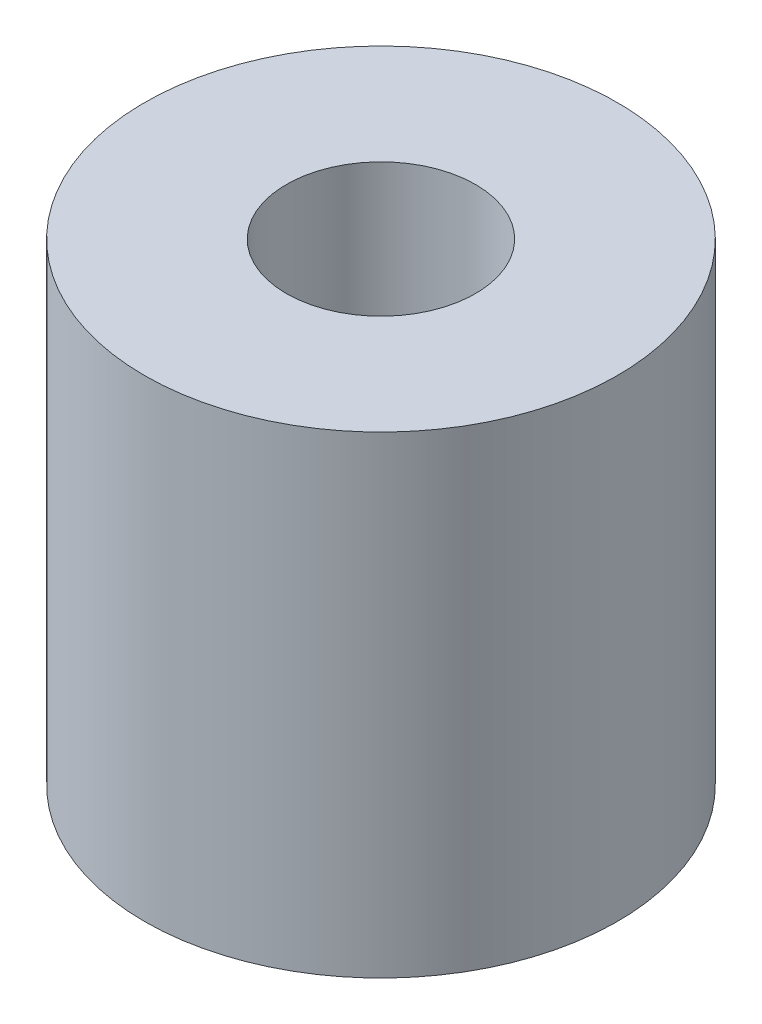
ISO-10303-21;
HEADER;
FILE_DESCRIPTION(('STEP AP214'),'2;1');
FILE_NAME('part.step','',(''),(''),'','','');
FILE_SCHEMA(('AUTOMOTIVE_DESIGN { 1 0 10303 214 1 1 1 1 }'));
ENDSEC;
DATA;
#1=APPLICATION_CONTEXT('core data for automotive mechanical design processes');
#2=APPLICATION_PROTOCOL_DEFINITION('international standard','automotive_design',2000,#1);
#3=PRODUCT_CONTEXT('',#1,'mechanical');
#4=PRODUCT('Part','Part','',(#3));
#5=PRODUCT_RELATED_PRODUCT_CATEGORY('part','',(#4));
#6=PRODUCT_DEFINITION_FORMATION('','',#4);
#7=PRODUCT_DEFINITION_CONTEXT('part definition',#1,'design');
#8=PRODUCT_DEFINITION('design','',#6,#7);
#9=PRODUCT_DEFINITION_SHAPE('','',#8);
#10=(LENGTH_UNIT() NAMED_UNIT(*) SI_UNIT(.MILLI.,.METRE.));
#11=(NAMED_UNIT(*) PLANE_ANGLE_UNIT() SI_UNIT($,.RADIAN.));
#12=(NAMED_UNIT(*) SI_UNIT($,.STERADIAN.) SOLID_ANGLE_UNIT());
#13=UNCERTAINTY_MEASURE_WITH_UNIT(LENGTH_MEASURE(1.E-05),#10,'distance_accuracy_value','');
#14=(GEOMETRIC_REPRESENTATION_CONTEXT(3) GLOBAL_UNCERTAINTY_ASSIGNED_CONTEXT((#13)) GLOBAL_UNIT_ASSIGNED_CONTEXT((#10,
#11,#12)) REPRESENTATION_CONTEXT('',''));
#15=CARTESIAN_POINT('',(0.,0.,0.));
#16=DIRECTION('',(0.,0.,1.));
#17=DIRECTION('',(1.,0.,0.));
#18=AXIS2_PLACEMENT_3D('',#15,#16,#17);
#19=CARTESIAN_POINT('',(0.,50.,0.));
#20=DIRECTION('',(0.,1.,0.));
#21=DIRECTION('',(0.,0.,1.));
#22=AXIS2_PLACEMENT_3D('',#19,#20,#21);
#23=PLANE('',#22);
#24=CARTESIAN_POINT('',(0.,50.,0.));
#25=DIRECTION('',(0.,1.,0.));
#26=DIRECTION('',(0.,0.,1.));
#27=AXIS2_PLACEMENT_3D('',#24,#25,#26);
#28=CIRCLE('',#27,25.);
#29=CARTESIAN_POINT('',(0.,50.,25.));
#30=VERTEX_POINT('',#29);
#31=EDGE_CURVE('E11',#30,#30,#28,.T.);
#32=ORIENTED_EDGE('',*,*,#31,.T.);
#33=EDGE_LOOP('',(#32));
#34=FACE_BOUND('',#33,.T.);
#35=CARTESIAN_POINT('',(0.,50.,0.));
#36=DIRECTION('',(0.,1.,0.));
#37=DIRECTION('',(0.,0.,1.));
#38=AXIS2_PLACEMENT_3D('',#35,#36,#37);
#39=CIRCLE('',#38,10.);
#40=CARTESIAN_POINT('',(0.,50.,10.));
#41=VERTEX_POINT('',#40);
#42=EDGE_CURVE('E62',#41,#41,#39,.T.);
#43=ORIENTED_EDGE('',*,*,#42,.F.);
#44=EDGE_LOOP('',(#43));
#45=FACE_BOUND('',#44,.T.);
#46=ADVANCED_FACE('F49',(#34,#45),#23,.T.);
#47=CARTESIAN_POINT('',(0.,0.,0.));
#48=DIRECTION('',(0.,1.,0.));
#49=DIRECTION('',(0.,0.,1.));
#50=AXIS2_PLACEMENT_3D('',#47,#48,#49);
#51=PLANE('',#50);
#52=CARTESIAN_POINT('',(0.,0.,0.));
#53=DIRECTION('',(0.,1.,0.));
#54=DIRECTION('',(0.,0.,1.));
#55=AXIS2_PLACEMENT_3D('',#52,#53,#54);
#56=CIRCLE('',#55,25.);
#57=CARTESIAN_POINT('',(0.,0.,25.));
#58=VERTEX_POINT('',#57);
#59=EDGE_CURVE('E53',#58,#58,#56,.T.);
#60=ORIENTED_EDGE('',*,*,#59,.F.);
#61=EDGE_LOOP('',(#60));
#62=FACE_BOUND('',#61,.T.);
#63=CARTESIAN_POINT('',(0.,0.,0.));
#64=DIRECTION('',(0.,1.,0.));
#65=DIRECTION('',(0.,0.,1.));
#66=AXIS2_PLACEMENT_3D('',#63,#64,#65);
#67=CIRCLE('',#66,10.);
#68=CARTESIAN_POINT('',(0.,0.,10.));
#69=VERTEX_POINT('',#68);
#70=EDGE_CURVE('E64',#69,#69,#67,.T.);
#71=ORIENTED_EDGE('',*,*,#70,.T.);
#72=EDGE_LOOP('',(#71));
#73=FACE_BOUND('',#72,.T.);
#74=ADVANCED_FACE('F76',(#62,#73),#51,.F.);
#75=CARTESIAN_POINT('',(0.,50.,0.));
#76=DIRECTION('',(0.,-1.,0.));
#77=DIRECTION('',(0.,0.,-1.));
#78=AXIS2_PLACEMENT_3D('',#75,#76,#77);
#79=CYLINDRICAL_SURFACE('',#78,25.);
#80=ORIENTED_EDGE('',*,*,#31,.F.);
#81=EDGE_LOOP('',(#80));
#82=FACE_BOUND('',#81,.T.);
#83=ORIENTED_EDGE('',*,*,#59,.T.);
#84=EDGE_LOOP('',(#83));
#85=FACE_BOUND('',#84,.T.);
#86=ADVANCED_FACE('F51',(#82,#85),#79,.T.);
#87=CARTESIAN_POINT('',(0.,50.,0.));
#88=DIRECTION('',(0.,-1.,0.));
#89=DIRECTION('',(0.,0.,-1.));
#90=AXIS2_PLACEMENT_3D('',#87,#88,#89);
#91=CYLINDRICAL_SURFACE('',#90,10.);
#92=ORIENTED_EDGE('',*,*,#42,.T.);
#93=EDGE_LOOP('',(#92));
#94=FACE_BOUND('',#93,.T.);
#95=ORIENTED_EDGE('',*,*,#70,.F.);
#96=EDGE_LOOP('',(#95));
#97=FACE_BOUND('',#96,.T.);
#98=ADVANCED_FACE('F72',(#94,#97),#91,.F.);
#99=CLOSED_SHELL('',(#46,#74,#86,#98));
#100=MANIFOLD_SOLID_BREP('B2',#99);
#101=ADVANCED_BREP_SHAPE_REPRESENTATION('',(#18,#100),#14);
#102=SHAPE_DEFINITION_REPRESENTATION(#9,#101);
ENDSEC;
END-ISO-10303-21;
